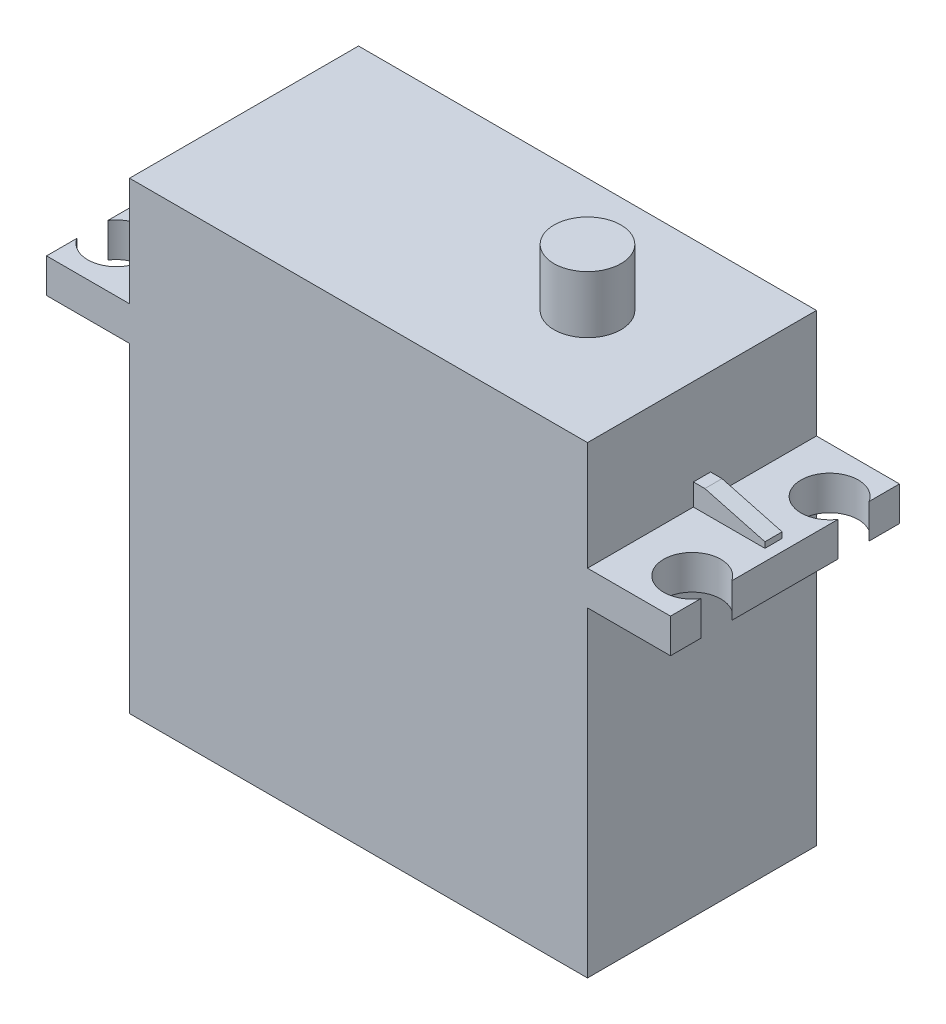
ISO-10303-21;
HEADER;
FILE_DESCRIPTION(('STEP AP214'),'2;1');
FILE_NAME('part.step','',(''),(''),'','','');
FILE_SCHEMA(('AUTOMOTIVE_DESIGN { 1 0 10303 214 1 1 1 1 }'));
ENDSEC;
DATA;
#1=APPLICATION_CONTEXT('core data for automotive mechanical design processes');
#2=APPLICATION_PROTOCOL_DEFINITION('international standard','automotive_design',2000,#1);
#3=PRODUCT_CONTEXT('',#1,'mechanical');
#4=PRODUCT('Part','Part','',(#3));
#5=PRODUCT_RELATED_PRODUCT_CATEGORY('part','',(#4));
#6=PRODUCT_DEFINITION_FORMATION('','',#4);
#7=PRODUCT_DEFINITION_CONTEXT('part definition',#1,'design');
#8=PRODUCT_DEFINITION('design','',#6,#7);
#9=PRODUCT_DEFINITION_SHAPE('','',#8);
#10=(LENGTH_UNIT() NAMED_UNIT(*) SI_UNIT(.MILLI.,.METRE.));
#11=(NAMED_UNIT(*) PLANE_ANGLE_UNIT() SI_UNIT($,.RADIAN.));
#12=(NAMED_UNIT(*) SI_UNIT($,.STERADIAN.) SOLID_ANGLE_UNIT());
#13=UNCERTAINTY_MEASURE_WITH_UNIT(LENGTH_MEASURE(1.E-05),#10,'distance_accuracy_value','');
#14=(GEOMETRIC_REPRESENTATION_CONTEXT(3) GLOBAL_UNCERTAINTY_ASSIGNED_CONTEXT((#13)) GLOBAL_UNIT_ASSIGNED_CONTEXT((#10,
#11,#12)) REPRESENTATION_CONTEXT('',''));
#15=CARTESIAN_POINT('',(0.,0.,0.));
#16=DIRECTION('',(0.,0.,1.));
#17=DIRECTION('',(1.,0.,0.));
#18=AXIS2_PLACEMENT_3D('',#15,#16,#17);
#19=CARTESIAN_POINT('',(0.,3.,0.));
#20=DIRECTION('',(0.,-1.,0.));
#21=DIRECTION('',(0.,0.,-1.));
#22=AXIS2_PLACEMENT_3D('',#19,#20,#21);
#23=PLANE('',#22);
#24=DIRECTION('',(1.,0.,0.));
#25=VECTOR('',#24,1.);
#26=CARTESIAN_POINT('',(-26.25,3.,0.749999999999995));
#27=LINE('',#26,#25);
#28=CARTESIAN_POINT('',(-26.25,3.,0.749999999999995));
#29=VERTEX_POINT('',#28);
#30=CARTESIAN_POINT('',(-20.,3.,0.749999999999995));
#31=VERTEX_POINT('',#30);
#32=EDGE_CURVE('E252',#29,#31,#27,.T.);
#33=ORIENTED_EDGE('',*,*,#32,.F.);
#34=DIRECTION('',(0.,0.,-1.));
#35=VECTOR('',#34,1.);
#36=CARTESIAN_POINT('',(-26.25,3.,0.749999999999995));
#37=LINE('',#36,#35);
#38=CARTESIAN_POINT('',(-26.25,3.,-0.750000000000005));
#39=VERTEX_POINT('',#38);
#40=EDGE_CURVE('E245',#29,#39,#37,.T.);
#41=ORIENTED_EDGE('',*,*,#40,.T.);
#42=DIRECTION('',(1.,0.,0.));
#43=VECTOR('',#42,1.);
#44=CARTESIAN_POINT('',(-26.25,3.,-0.750000000000005));
#45=LINE('',#44,#43);
#46=CARTESIAN_POINT('',(-20.,3.,-0.750000000000005));
#47=VERTEX_POINT('',#46);
#48=EDGE_CURVE('E230',#39,#47,#45,.T.);
#49=ORIENTED_EDGE('',*,*,#48,.T.);
#50=DIRECTION('',(0.,0.,1.));
#51=VECTOR('',#50,1.);
#52=CARTESIAN_POINT('',(-20.,3.,-10.));
#53=LINE('',#52,#51);
#54=CARTESIAN_POINT('',(-20.,3.,-10.));
#55=VERTEX_POINT('',#54);
#56=EDGE_CURVE('E334',#55,#47,#53,.T.);
#57=ORIENTED_EDGE('',*,*,#56,.F.);
#58=DIRECTION('',(-1.,0.,0.));
#59=VECTOR('',#58,1.);
#60=CARTESIAN_POINT('',(27.25,3.,-10.));
#61=LINE('',#60,#59);
#62=CARTESIAN_POINT('',(-27.25,3.,-10.));
#63=VERTEX_POINT('',#62);
#64=EDGE_CURVE('E371',#55,#63,#61,.T.);
#65=ORIENTED_EDGE('',*,*,#64,.T.);
#66=DIRECTION('',(0.,0.,1.));
#67=VECTOR('',#66,1.);
#68=CARTESIAN_POINT('',(-27.25,3.,-10.));
#69=LINE('',#68,#67);
#70=CARTESIAN_POINT('',(-27.25,3.,-7.35646599662505));
#71=VERTEX_POINT('',#70);
#72=EDGE_CURVE('E358',#63,#71,#69,.T.);
#73=ORIENTED_EDGE('',*,*,#72,.T.);
#74=CARTESIAN_POINT('',(-25.15,3.,-6.));
#75=DIRECTION('',(0.,1.,0.));
#76=DIRECTION('',(0.,0.,1.));
#77=AXIS2_PLACEMENT_3D('',#74,#75,#76);
#78=CIRCLE('',#77,2.5);
#79=CARTESIAN_POINT('',(-27.25,3.,-4.64353400337495));
#80=VERTEX_POINT('',#79);
#81=EDGE_CURVE('E291',#80,#71,#78,.T.);
#82=ORIENTED_EDGE('',*,*,#81,.F.);
#83=CARTESIAN_POINT('',(-27.25,3.,4.64353400337495));
#84=VERTEX_POINT('',#83);
#85=EDGE_CURVE('E362',#80,#84,#69,.T.);
#86=ORIENTED_EDGE('',*,*,#85,.T.);
#87=CARTESIAN_POINT('',(-25.15,3.,6.));
#88=DIRECTION('',(0.,1.,0.));
#89=DIRECTION('',(0.,0.,1.));
#90=AXIS2_PLACEMENT_3D('',#87,#88,#89);
#91=CIRCLE('',#90,2.5);
#92=CARTESIAN_POINT('',(-27.25,3.,7.35646599662505));
#93=VERTEX_POINT('',#92);
#94=EDGE_CURVE('E302',#93,#84,#91,.T.);
#95=ORIENTED_EDGE('',*,*,#94,.F.);
#96=CARTESIAN_POINT('',(-27.25,3.,10.));
#97=VERTEX_POINT('',#96);
#98=EDGE_CURVE('E363',#93,#97,#69,.T.);
#99=ORIENTED_EDGE('',*,*,#98,.T.);
#100=DIRECTION('',(1.,0.,0.));
#101=VECTOR('',#100,1.);
#102=CARTESIAN_POINT('',(27.25,3.,10.));
#103=LINE('',#102,#101);
#104=CARTESIAN_POINT('',(-20.,3.,10.));
#105=VERTEX_POINT('',#104);
#106=EDGE_CURVE('E364',#97,#105,#103,.T.);
#107=ORIENTED_EDGE('',*,*,#106,.T.);
#108=EDGE_CURVE('E344',#31,#105,#53,.T.);
#109=ORIENTED_EDGE('',*,*,#108,.F.);
#110=EDGE_LOOP('',(#33,#41,#49,#57,#65,#73,#82,#86,#95,#99,#107,#109));
#111=FACE_BOUND('',#110,.T.);
#112=ADVANCED_FACE('F32',(#111),#23,.F.);
#113=CARTESIAN_POINT('',(-20.,12.5,-10.));
#114=DIRECTION('',(1.,0.,0.));
#115=DIRECTION('',(0.,0.,-1.));
#116=AXIS2_PLACEMENT_3D('',#113,#114,#115);
#117=PLANE('',#116);
#118=DIRECTION('',(0.,1.,0.));
#119=VECTOR('',#118,1.);
#120=CARTESIAN_POINT('',(-20.,3.,0.749999999999995));
#121=LINE('',#120,#119);
#122=CARTESIAN_POINT('',(-20.,4.9,0.749999999999995));
#123=VERTEX_POINT('',#122);
#124=EDGE_CURVE('E253',#31,#123,#121,.T.);
#125=ORIENTED_EDGE('',*,*,#124,.F.);
#126=ORIENTED_EDGE('',*,*,#108,.T.);
#127=DIRECTION('',(0.,-1.,0.));
#128=VECTOR('',#127,1.);
#129=CARTESIAN_POINT('',(-20.,12.5,10.));
#130=LINE('',#129,#128);
#131=CARTESIAN_POINT('',(-20.,12.5,10.));
#132=VERTEX_POINT('',#131);
#133=EDGE_CURVE('E340',#132,#105,#130,.T.);
#134=ORIENTED_EDGE('',*,*,#133,.F.);
#135=DIRECTION('',(0.,0.,1.));
#136=VECTOR('',#135,1.);
#137=CARTESIAN_POINT('',(-20.,12.5,-10.));
#138=LINE('',#137,#136);
#139=CARTESIAN_POINT('',(-20.,12.5,-10.));
#140=VERTEX_POINT('',#139);
#141=EDGE_CURVE('E338',#140,#132,#138,.T.);
#142=ORIENTED_EDGE('',*,*,#141,.F.);
#143=DIRECTION('',(0.,-1.,0.));
#144=VECTOR('',#143,1.);
#145=CARTESIAN_POINT('',(-20.,12.5,-10.));
#146=LINE('',#145,#144);
#147=EDGE_CURVE('E348',#140,#55,#146,.T.);
#148=ORIENTED_EDGE('',*,*,#147,.T.);
#149=ORIENTED_EDGE('',*,*,#56,.T.);
#150=DIRECTION('',(0.,1.,0.));
#151=VECTOR('',#150,1.);
#152=CARTESIAN_POINT('',(-20.,3.,-0.750000000000005));
#153=LINE('',#152,#151);
#154=CARTESIAN_POINT('',(-20.,4.9,-0.750000000000006));
#155=VERTEX_POINT('',#154);
#156=EDGE_CURVE('E236',#47,#155,#153,.T.);
#157=ORIENTED_EDGE('',*,*,#156,.T.);
#158=DIRECTION('',(0.,0.,-1.));
#159=VECTOR('',#158,1.);
#160=CARTESIAN_POINT('',(-20.,4.9,0.749999999999995));
#161=LINE('',#160,#159);
#162=EDGE_CURVE('E263',#123,#155,#161,.T.);
#163=ORIENTED_EDGE('',*,*,#162,.F.);
#164=EDGE_LOOP('',(#125,#126,#134,#142,#148,#149,#157,#163));
#165=FACE_BOUND('',#164,.T.);
#166=ADVANCED_FACE('F493',(#165),#117,.F.);
#167=DIRECTION('',(-1.,0.,0.));
#168=VECTOR('',#167,1.);
#169=CARTESIAN_POINT('',(26.25,3.,0.749999999999995));
#170=LINE('',#169,#168);
#171=CARTESIAN_POINT('',(26.25,3.,0.749999999999995));
#172=VERTEX_POINT('',#171);
#173=CARTESIAN_POINT('',(20.,3.,0.749999999999995));
#174=VERTEX_POINT('',#173);
#175=EDGE_CURVE('E273',#172,#174,#170,.T.);
#176=ORIENTED_EDGE('',*,*,#175,.T.);
#177=DIRECTION('',(0.,0.,-1.));
#178=VECTOR('',#177,1.);
#179=CARTESIAN_POINT('',(20.,3.,9.99999999999999));
#180=LINE('',#179,#178);
#181=CARTESIAN_POINT('',(20.,3.,10.));
#182=VERTEX_POINT('',#181);
#183=EDGE_CURVE('E341',#182,#174,#180,.T.);
#184=ORIENTED_EDGE('',*,*,#183,.F.);
#185=CARTESIAN_POINT('',(27.25,3.,10.));
#186=VERTEX_POINT('',#185);
#187=EDGE_CURVE('E361',#182,#186,#103,.T.);
#188=ORIENTED_EDGE('',*,*,#187,.T.);
#189=DIRECTION('',(0.,0.,-1.));
#190=VECTOR('',#189,1.);
#191=CARTESIAN_POINT('',(27.25,3.,-10.));
#192=LINE('',#191,#190);
#193=CARTESIAN_POINT('',(27.25,3.,7.35646599662505));
#194=VERTEX_POINT('',#193);
#195=EDGE_CURVE('E368',#186,#194,#192,.T.);
#196=ORIENTED_EDGE('',*,*,#195,.T.);
#197=CARTESIAN_POINT('',(25.15,3.,6.));
#198=DIRECTION('',(0.,1.,0.));
#199=DIRECTION('',(0.,0.,1.));
#200=AXIS2_PLACEMENT_3D('',#197,#198,#199);
#201=CIRCLE('',#200,2.5);
#202=CARTESIAN_POINT('',(27.25,3.,4.64353400337495));
#203=VERTEX_POINT('',#202);
#204=EDGE_CURVE('E305',#203,#194,#201,.T.);
#205=ORIENTED_EDGE('',*,*,#204,.F.);
#206=CARTESIAN_POINT('',(27.25,3.,-4.64353400337495));
#207=VERTEX_POINT('',#206);
#208=EDGE_CURVE('E372',#203,#207,#192,.T.);
#209=ORIENTED_EDGE('',*,*,#208,.T.);
#210=CARTESIAN_POINT('',(25.15,3.,-6.));
#211=DIRECTION('',(0.,1.,0.));
#212=DIRECTION('',(0.,0.,1.));
#213=AXIS2_PLACEMENT_3D('',#210,#211,#212);
#214=CIRCLE('',#213,2.5);
#215=CARTESIAN_POINT('',(27.25,3.,-7.35646599662505));
#216=VERTEX_POINT('',#215);
#217=EDGE_CURVE('E303',#216,#207,#214,.T.);
#218=ORIENTED_EDGE('',*,*,#217,.F.);
#219=CARTESIAN_POINT('',(27.25,3.,-10.));
#220=VERTEX_POINT('',#219);
#221=EDGE_CURVE('E367',#216,#220,#192,.T.);
#222=ORIENTED_EDGE('',*,*,#221,.T.);
#223=CARTESIAN_POINT('',(20.,3.,-10.));
#224=VERTEX_POINT('',#223);
#225=EDGE_CURVE('E373',#220,#224,#61,.T.);
#226=ORIENTED_EDGE('',*,*,#225,.T.);
#227=CARTESIAN_POINT('',(20.,3.,-0.750000000000006));
#228=VERTEX_POINT('',#227);
#229=EDGE_CURVE('E327',#228,#224,#180,.T.);
#230=ORIENTED_EDGE('',*,*,#229,.F.);
#231=DIRECTION('',(-1.,0.,0.));
#232=VECTOR('',#231,1.);
#233=CARTESIAN_POINT('',(26.25,3.,-0.750000000000005));
#234=LINE('',#233,#232);
#235=CARTESIAN_POINT('',(26.25,3.,-0.750000000000005));
#236=VERTEX_POINT('',#235);
#237=EDGE_CURVE('E55',#236,#228,#234,.T.);
#238=ORIENTED_EDGE('',*,*,#237,.F.);
#239=DIRECTION('',(0.,0.,-1.));
#240=VECTOR('',#239,1.);
#241=CARTESIAN_POINT('',(26.25,3.,0.749999999999995));
#242=LINE('',#241,#240);
#243=EDGE_CURVE('E289',#172,#236,#242,.T.);
#244=ORIENTED_EDGE('',*,*,#243,.F.);
#245=EDGE_LOOP('',(#176,#184,#188,#196,#205,#209,#218,#222,#226,#230,#238,#244));
#246=FACE_BOUND('',#245,.T.);
#247=ADVANCED_FACE('F495',(#246),#23,.F.);
#248=CARTESIAN_POINT('',(20.,12.5,9.99999999999999));
#249=DIRECTION('',(-1.,0.,0.));
#250=DIRECTION('',(0.,0.,1.));
#251=AXIS2_PLACEMENT_3D('',#248,#249,#250);
#252=PLANE('',#251);
#253=DIRECTION('',(0.,1.,0.));
#254=VECTOR('',#253,1.);
#255=CARTESIAN_POINT('',(20.,3.,0.749999999999995));
#256=LINE('',#255,#254);
#257=CARTESIAN_POINT('',(20.,4.9,0.749999999999995));
#258=VERTEX_POINT('',#257);
#259=EDGE_CURVE('E276',#174,#258,#256,.T.);
#260=ORIENTED_EDGE('',*,*,#259,.T.);
#261=DIRECTION('',(0.,0.,-1.));
#262=VECTOR('',#261,1.);
#263=CARTESIAN_POINT('',(20.,4.9,0.749999999999995));
#264=LINE('',#263,#262);
#265=CARTESIAN_POINT('',(20.,4.9,-0.750000000000005));
#266=VERTEX_POINT('',#265);
#267=EDGE_CURVE('E288',#258,#266,#264,.T.);
#268=ORIENTED_EDGE('',*,*,#267,.T.);
#269=DIRECTION('',(0.,1.,0.));
#270=VECTOR('',#269,1.);
#271=CARTESIAN_POINT('',(20.,3.,-0.750000000000005));
#272=LINE('',#271,#270);
#273=EDGE_CURVE('E262',#228,#266,#272,.T.);
#274=ORIENTED_EDGE('',*,*,#273,.F.);
#275=ORIENTED_EDGE('',*,*,#229,.T.);
#276=DIRECTION('',(0.,-1.,0.));
#277=VECTOR('',#276,1.);
#278=CARTESIAN_POINT('',(20.,12.5,-10.));
#279=LINE('',#278,#277);
#280=CARTESIAN_POINT('',(20.,12.5,-10.));
#281=VERTEX_POINT('',#280);
#282=EDGE_CURVE('E351',#281,#224,#279,.T.);
#283=ORIENTED_EDGE('',*,*,#282,.F.);
#284=DIRECTION('',(0.,0.,-1.));
#285=VECTOR('',#284,1.);
#286=CARTESIAN_POINT('',(20.,12.5,9.99999999999999));
#287=LINE('',#286,#285);
#288=CARTESIAN_POINT('',(20.,12.5,9.99999999999999));
#289=VERTEX_POINT('',#288);
#290=EDGE_CURVE('E333',#289,#281,#287,.T.);
#291=ORIENTED_EDGE('',*,*,#290,.F.);
#292=DIRECTION('',(0.,-1.,0.));
#293=VECTOR('',#292,1.);
#294=CARTESIAN_POINT('',(20.,12.5,9.99999999999999));
#295=LINE('',#294,#293);
#296=EDGE_CURVE('E354',#289,#182,#295,.T.);
#297=ORIENTED_EDGE('',*,*,#296,.T.);
#298=ORIENTED_EDGE('',*,*,#183,.T.);
#299=EDGE_LOOP('',(#260,#268,#274,#275,#283,#291,#297,#298));
#300=FACE_BOUND('',#299,.T.);
#301=ADVANCED_FACE('F504',(#300),#252,.F.);
#302=CARTESIAN_POINT('',(-27.25,3.,-10.));
#303=DIRECTION('',(1.,0.,0.));
#304=DIRECTION('',(0.,0.,-1.));
#305=AXIS2_PLACEMENT_3D('',#302,#303,#304);
#306=PLANE('',#305);
#307=DIRECTION('',(0.,0.,1.));
#308=VECTOR('',#307,1.);
#309=CARTESIAN_POINT('',(-27.25,0.,-10.));
#310=LINE('',#309,#308);
#311=CARTESIAN_POINT('',(-27.25,0.,-4.64353400337495));
#312=VERTEX_POINT('',#311);
#313=CARTESIAN_POINT('',(-27.25,0.,4.64353400337495));
#314=VERTEX_POINT('',#313);
#315=EDGE_CURVE('E381',#312,#314,#310,.T.);
#316=ORIENTED_EDGE('',*,*,#315,.T.);
#317=DIRECTION('',(0.,1.,0.));
#318=VECTOR('',#317,1.);
#319=CARTESIAN_POINT('',(-27.25,-7.07106781186547,4.64353400337495));
#320=LINE('',#319,#318);
#321=EDGE_CURVE('E11',#314,#84,#320,.T.);
#322=ORIENTED_EDGE('',*,*,#321,.T.);
#323=ORIENTED_EDGE('',*,*,#85,.F.);
#324=DIRECTION('',(0.,1.,0.));
#325=VECTOR('',#324,1.);
#326=CARTESIAN_POINT('',(-27.25,-7.07106781186547,-4.64353400337495));
#327=LINE('',#326,#325);
#328=EDGE_CURVE('E435',#80,#312,#327,.F.);
#329=ORIENTED_EDGE('',*,*,#328,.T.);
#330=EDGE_LOOP('',(#316,#322,#323,#329));
#331=FACE_BOUND('',#330,.T.);
#332=ADVANCED_FACE('F454',(#331),#306,.F.);
#333=CARTESIAN_POINT('',(-27.25,0.,-10.));
#334=VERTEX_POINT('',#333);
#335=CARTESIAN_POINT('',(-27.25,0.,-7.35646599662505));
#336=VERTEX_POINT('',#335);
#337=EDGE_CURVE('E377',#334,#336,#310,.T.);
#338=ORIENTED_EDGE('',*,*,#337,.T.);
#339=DIRECTION('',(0.,1.,0.));
#340=VECTOR('',#339,1.);
#341=CARTESIAN_POINT('',(-27.25,-7.07106781186547,-7.35646599662505));
#342=LINE('',#341,#340);
#343=EDGE_CURVE('E438',#336,#71,#342,.T.);
#344=ORIENTED_EDGE('',*,*,#343,.T.);
#345=ORIENTED_EDGE('',*,*,#72,.F.);
#346=DIRECTION('',(0.,-1.,0.));
#347=VECTOR('',#346,1.);
#348=CARTESIAN_POINT('',(-27.25,3.,-10.));
#349=LINE('',#348,#347);
#350=EDGE_CURVE('E376',#63,#334,#349,.T.);
#351=ORIENTED_EDGE('',*,*,#350,.T.);
#352=EDGE_LOOP('',(#338,#344,#345,#351));
#353=FACE_BOUND('',#352,.T.);
#354=ADVANCED_FACE('F461',(#353),#306,.F.);
#355=CARTESIAN_POINT('',(27.25,3.,-10.));
#356=DIRECTION('',(-1.,0.,0.));
#357=DIRECTION('',(0.,0.,1.));
#358=AXIS2_PLACEMENT_3D('',#355,#356,#357);
#359=PLANE('',#358);
#360=DIRECTION('',(0.,0.,-1.));
#361=VECTOR('',#360,1.);
#362=CARTESIAN_POINT('',(27.25,0.,-10.));
#363=LINE('',#362,#361);
#364=CARTESIAN_POINT('',(27.25,0.,4.64353400337495));
#365=VERTEX_POINT('',#364);
#366=CARTESIAN_POINT('',(27.25,0.,-4.64353400337495));
#367=VERTEX_POINT('',#366);
#368=EDGE_CURVE('E390',#365,#367,#363,.T.);
#369=ORIENTED_EDGE('',*,*,#368,.T.);
#370=DIRECTION('',(0.,1.,0.));
#371=VECTOR('',#370,1.);
#372=CARTESIAN_POINT('',(27.25,-7.07106781186547,-4.64353400337495));
#373=LINE('',#372,#371);
#374=EDGE_CURVE('E320',#367,#207,#373,.T.);
#375=ORIENTED_EDGE('',*,*,#374,.T.);
#376=ORIENTED_EDGE('',*,*,#208,.F.);
#377=DIRECTION('',(0.,1.,0.));
#378=VECTOR('',#377,1.);
#379=CARTESIAN_POINT('',(27.25,-7.07106781186547,4.64353400337495));
#380=LINE('',#379,#378);
#381=EDGE_CURVE('E311',#203,#365,#380,.F.);
#382=ORIENTED_EDGE('',*,*,#381,.T.);
#383=EDGE_LOOP('',(#369,#375,#376,#382));
#384=FACE_BOUND('',#383,.T.);
#385=ADVANCED_FACE('F554',(#384),#359,.F.);
#386=CARTESIAN_POINT('',(27.25,0.,10.));
#387=VERTEX_POINT('',#386);
#388=CARTESIAN_POINT('',(27.25,0.,7.35646599662505));
#389=VERTEX_POINT('',#388);
#390=EDGE_CURVE('E386',#387,#389,#363,.T.);
#391=ORIENTED_EDGE('',*,*,#390,.T.);
#392=DIRECTION('',(0.,1.,0.));
#393=VECTOR('',#392,1.);
#394=CARTESIAN_POINT('',(27.25,-7.07106781186547,7.35646599662505));
#395=LINE('',#394,#393);
#396=EDGE_CURVE('E314',#389,#194,#395,.T.);
#397=ORIENTED_EDGE('',*,*,#396,.T.);
#398=ORIENTED_EDGE('',*,*,#195,.F.);
#399=DIRECTION('',(0.,-1.,0.));
#400=VECTOR('',#399,1.);
#401=CARTESIAN_POINT('',(27.25,3.,10.));
#402=LINE('',#401,#400);
#403=EDGE_CURVE('E399',#186,#387,#402,.T.);
#404=ORIENTED_EDGE('',*,*,#403,.T.);
#405=EDGE_LOOP('',(#391,#397,#398,#404));
#406=FACE_BOUND('',#405,.T.);
#407=ADVANCED_FACE('F522',(#406),#359,.F.);
#408=CARTESIAN_POINT('',(-20.,-28.,-10.));
#409=DIRECTION('',(-1.,0.,0.));
#410=DIRECTION('',(0.,0.,1.));
#411=AXIS2_PLACEMENT_3D('',#408,#409,#410);
#412=PLANE('',#411);
#413=DIRECTION('',(0.,0.,1.));
#414=VECTOR('',#413,1.);
#415=CARTESIAN_POINT('',(-20.,0.,-10.));
#416=LINE('',#415,#414);
#417=CARTESIAN_POINT('',(-20.,0.,-10.));
#418=VERTEX_POINT('',#417);
#419=CARTESIAN_POINT('',(-20.,0.,10.));
#420=VERTEX_POINT('',#419);
#421=EDGE_CURVE('E405',#418,#420,#416,.T.);
#422=ORIENTED_EDGE('',*,*,#421,.F.);
#423=DIRECTION('',(0.,1.,0.));
#424=VECTOR('',#423,1.);
#425=CARTESIAN_POINT('',(-20.,-28.,-10.));
#426=LINE('',#425,#424);
#427=CARTESIAN_POINT('',(-20.,-28.,-10.));
#428=VERTEX_POINT('',#427);
#429=EDGE_CURVE('E424',#428,#418,#426,.T.);
#430=ORIENTED_EDGE('',*,*,#429,.F.);
#431=DIRECTION('',(0.,0.,1.));
#432=VECTOR('',#431,1.);
#433=CARTESIAN_POINT('',(-20.,-28.,-10.));
#434=LINE('',#433,#432);
#435=CARTESIAN_POINT('',(-20.,-28.,10.));
#436=VERTEX_POINT('',#435);
#437=EDGE_CURVE('E406',#428,#436,#434,.T.);
#438=ORIENTED_EDGE('',*,*,#437,.T.);
#439=DIRECTION('',(0.,1.,0.));
#440=VECTOR('',#439,1.);
#441=CARTESIAN_POINT('',(-20.,-28.,10.));
#442=LINE('',#441,#440);
#443=EDGE_CURVE('E419',#436,#420,#442,.T.);
#444=ORIENTED_EDGE('',*,*,#443,.T.);
#445=EDGE_LOOP('',(#422,#430,#438,#444));
#446=FACE_BOUND('',#445,.T.);
#447=ADVANCED_FACE('F34',(#446),#412,.T.);
#448=CARTESIAN_POINT('',(20.,-28.,-10.));
#449=DIRECTION('',(0.,0.,-1.));
#450=DIRECTION('',(-1.,0.,0.));
#451=AXIS2_PLACEMENT_3D('',#448,#449,#450);
#452=PLANE('',#451);
#453=ORIENTED_EDGE('',*,*,#429,.T.);
#454=DIRECTION('',(-1.,0.,0.));
#455=VECTOR('',#454,1.);
#456=CARTESIAN_POINT('',(27.25,0.,-10.));
#457=LINE('',#456,#455);
#458=EDGE_CURVE('E389',#418,#334,#457,.T.);
#459=ORIENTED_EDGE('',*,*,#458,.T.);
#460=ORIENTED_EDGE('',*,*,#350,.F.);
#461=ORIENTED_EDGE('',*,*,#64,.F.);
#462=ORIENTED_EDGE('',*,*,#147,.F.);
#463=DIRECTION('',(-1.,0.,0.));
#464=VECTOR('',#463,1.);
#465=CARTESIAN_POINT('',(20.,12.5,-10.));
#466=LINE('',#465,#464);
#467=EDGE_CURVE('E336',#281,#140,#466,.T.);
#468=ORIENTED_EDGE('',*,*,#467,.F.);
#469=ORIENTED_EDGE('',*,*,#282,.T.);
#470=ORIENTED_EDGE('',*,*,#225,.F.);
#471=DIRECTION('',(0.,-1.,0.));
#472=VECTOR('',#471,1.);
#473=CARTESIAN_POINT('',(27.25,3.,-10.));
#474=LINE('',#473,#472);
#475=CARTESIAN_POINT('',(27.25,0.,-10.));
#476=VERTEX_POINT('',#475);
#477=EDGE_CURVE('E396',#220,#476,#474,.T.);
#478=ORIENTED_EDGE('',*,*,#477,.T.);
#479=CARTESIAN_POINT('',(20.,0.,-10.));
#480=VERTEX_POINT('',#479);
#481=EDGE_CURVE('E391',#476,#480,#457,.T.);
#482=ORIENTED_EDGE('',*,*,#481,.T.);
#483=DIRECTION('',(0.,1.,0.));
#484=VECTOR('',#483,1.);
#485=CARTESIAN_POINT('',(20.,-28.,-10.));
#486=LINE('',#485,#484);
#487=CARTESIAN_POINT('',(20.,-28.,-10.));
#488=VERTEX_POINT('',#487);
#489=EDGE_CURVE('E427',#488,#480,#486,.T.);
#490=ORIENTED_EDGE('',*,*,#489,.F.);
#491=DIRECTION('',(-1.,0.,0.));
#492=VECTOR('',#491,1.);
#493=CARTESIAN_POINT('',(20.,-28.,-10.));
#494=LINE('',#493,#492);
#495=EDGE_CURVE('E416',#488,#428,#494,.T.);
#496=ORIENTED_EDGE('',*,*,#495,.T.);
#497=EDGE_LOOP('',(#453,#459,#460,#461,#462,#468,#469,#470,#478,#482,#490,#496));
#498=FACE_BOUND('',#497,.T.);
#499=ADVANCED_FACE('F466',(#498),#452,.T.);
#500=CARTESIAN_POINT('',(20.,-28.,-10.));
#501=DIRECTION('',(1.,0.,0.));
#502=DIRECTION('',(0.,0.,-1.));
#503=AXIS2_PLACEMENT_3D('',#500,#501,#502);
#504=PLANE('',#503);
#505=DIRECTION('',(0.,0.,-1.));
#506=VECTOR('',#505,1.);
#507=CARTESIAN_POINT('',(20.,0.,-10.));
#508=LINE('',#507,#506);
#509=CARTESIAN_POINT('',(20.,0.,9.99999999999999));
#510=VERTEX_POINT('',#509);
#511=EDGE_CURVE('E410',#510,#480,#508,.T.);
#512=ORIENTED_EDGE('',*,*,#511,.F.);
#513=DIRECTION('',(0.,1.,0.));
#514=VECTOR('',#513,1.);
#515=CARTESIAN_POINT('',(20.,-28.,9.99999999999999));
#516=LINE('',#515,#514);
#517=CARTESIAN_POINT('',(20.,-28.,9.99999999999999));
#518=VERTEX_POINT('',#517);
#519=EDGE_CURVE('E429',#518,#510,#516,.T.);
#520=ORIENTED_EDGE('',*,*,#519,.F.);
#521=DIRECTION('',(0.,0.,-1.));
#522=VECTOR('',#521,1.);
#523=CARTESIAN_POINT('',(20.,-28.,-10.));
#524=LINE('',#523,#522);
#525=EDGE_CURVE('E413',#518,#488,#524,.T.);
#526=ORIENTED_EDGE('',*,*,#525,.T.);
#527=ORIENTED_EDGE('',*,*,#489,.T.);
#528=EDGE_LOOP('',(#512,#520,#526,#527));
#529=FACE_BOUND('',#528,.T.);
#530=ADVANCED_FACE('F542',(#529),#504,.T.);
#531=CARTESIAN_POINT('',(20.,-28.,9.99999999999999));
#532=DIRECTION('',(0.,0.,1.));
#533=DIRECTION('',(1.,0.,0.));
#534=AXIS2_PLACEMENT_3D('',#531,#532,#533);
#535=PLANE('',#534);
#536=ORIENTED_EDGE('',*,*,#519,.T.);
#537=DIRECTION('',(1.,0.,0.));
#538=VECTOR('',#537,1.);
#539=CARTESIAN_POINT('',(27.25,0.,10.));
#540=LINE('',#539,#538);
#541=EDGE_CURVE('E380',#510,#387,#540,.T.);
#542=ORIENTED_EDGE('',*,*,#541,.T.);
#543=ORIENTED_EDGE('',*,*,#403,.F.);
#544=ORIENTED_EDGE('',*,*,#187,.F.);
#545=ORIENTED_EDGE('',*,*,#296,.F.);
#546=DIRECTION('',(1.,0.,0.));
#547=VECTOR('',#546,1.);
#548=CARTESIAN_POINT('',(-20.,12.5,10.));
#549=LINE('',#548,#547);
#550=EDGE_CURVE('E330',#132,#289,#549,.T.);
#551=ORIENTED_EDGE('',*,*,#550,.F.);
#552=ORIENTED_EDGE('',*,*,#133,.T.);
#553=ORIENTED_EDGE('',*,*,#106,.F.);
#554=DIRECTION('',(0.,-1.,0.));
#555=VECTOR('',#554,1.);
#556=CARTESIAN_POINT('',(-27.25,3.,10.));
#557=LINE('',#556,#555);
#558=CARTESIAN_POINT('',(-27.25,0.,10.));
#559=VERTEX_POINT('',#558);
#560=EDGE_CURVE('E402',#97,#559,#557,.T.);
#561=ORIENTED_EDGE('',*,*,#560,.T.);
#562=EDGE_CURVE('E382',#559,#420,#540,.T.);
#563=ORIENTED_EDGE('',*,*,#562,.T.);
#564=ORIENTED_EDGE('',*,*,#443,.F.);
#565=DIRECTION('',(1.,0.,0.));
#566=VECTOR('',#565,1.);
#567=CARTESIAN_POINT('',(20.,-28.,9.99999999999999));
#568=LINE('',#567,#566);
#569=EDGE_CURVE('E409',#436,#518,#568,.T.);
#570=ORIENTED_EDGE('',*,*,#569,.T.);
#571=EDGE_LOOP('',(#536,#542,#543,#544,#545,#551,#552,#553,#561,#563,#564,#570));
#572=FACE_BOUND('',#571,.T.);
#573=ADVANCED_FACE('F471',(#572),#535,.T.);
#574=CARTESIAN_POINT('',(0.,-28.,0.));
#575=DIRECTION('',(0.,-1.,0.));
#576=DIRECTION('',(0.,0.,-1.));
#577=AXIS2_PLACEMENT_3D('',#574,#575,#576);
#578=PLANE('',#577);
#579=ORIENTED_EDGE('',*,*,#437,.F.);
#580=ORIENTED_EDGE('',*,*,#495,.F.);
#581=ORIENTED_EDGE('',*,*,#525,.F.);
#582=ORIENTED_EDGE('',*,*,#569,.F.);
#583=EDGE_LOOP('',(#579,#580,#581,#582));
#584=FACE_BOUND('',#583,.T.);
#585=ADVANCED_FACE('F547',(#584),#578,.T.);
#586=CARTESIAN_POINT('',(0.,0.,0.));
#587=DIRECTION('',(0.,-1.,0.));
#588=DIRECTION('',(0.,0.,-1.));
#589=AXIS2_PLACEMENT_3D('',#586,#587,#588);
#590=PLANE('',#589);
#591=CARTESIAN_POINT('',(-25.15,0.,6.));
#592=DIRECTION('',(0.,-1.,0.));
#593=DIRECTION('',(0.,0.,-1.));
#594=AXIS2_PLACEMENT_3D('',#591,#592,#593);
#595=CIRCLE('',#594,2.5);
#596=CARTESIAN_POINT('',(-27.25,0.,7.35646599662505));
#597=VERTEX_POINT('',#596);
#598=EDGE_CURVE('E306',#597,#314,#595,.F.);
#599=ORIENTED_EDGE('',*,*,#598,.T.);
#600=ORIENTED_EDGE('',*,*,#315,.F.);
#601=CARTESIAN_POINT('',(-25.15,0.,-6.));
#602=DIRECTION('',(0.,-1.,0.));
#603=DIRECTION('',(0.,0.,-1.));
#604=AXIS2_PLACEMENT_3D('',#601,#602,#603);
#605=CIRCLE('',#604,2.5);
#606=EDGE_CURVE('E299',#312,#336,#605,.F.);
#607=ORIENTED_EDGE('',*,*,#606,.T.);
#608=ORIENTED_EDGE('',*,*,#337,.F.);
#609=ORIENTED_EDGE('',*,*,#458,.F.);
#610=ORIENTED_EDGE('',*,*,#421,.T.);
#611=ORIENTED_EDGE('',*,*,#562,.F.);
#612=EDGE_CURVE('E357',#597,#559,#310,.T.);
#613=ORIENTED_EDGE('',*,*,#612,.F.);
#614=EDGE_LOOP('',(#599,#600,#607,#608,#609,#610,#611,#613));
#615=FACE_BOUND('',#614,.T.);
#616=ADVANCED_FACE('F450',(#615),#590,.T.);
#617=ORIENTED_EDGE('',*,*,#98,.F.);
#618=DIRECTION('',(0.,1.,0.));
#619=VECTOR('',#618,1.);
#620=CARTESIAN_POINT('',(-27.25,-7.07106781186547,7.35646599662505));
#621=LINE('',#620,#619);
#622=EDGE_CURVE('E40',#93,#597,#621,.F.);
#623=ORIENTED_EDGE('',*,*,#622,.T.);
#624=ORIENTED_EDGE('',*,*,#612,.T.);
#625=ORIENTED_EDGE('',*,*,#560,.F.);
#626=EDGE_LOOP('',(#617,#623,#624,#625));
#627=FACE_BOUND('',#626,.T.);
#628=ADVANCED_FACE('F444',(#627),#306,.F.);
#629=ORIENTED_EDGE('',*,*,#221,.F.);
#630=DIRECTION('',(0.,1.,0.));
#631=VECTOR('',#630,1.);
#632=CARTESIAN_POINT('',(27.25,-7.07106781186547,-7.35646599662505));
#633=LINE('',#632,#631);
#634=CARTESIAN_POINT('',(27.25,0.,-7.35646599662505));
#635=VERTEX_POINT('',#634);
#636=EDGE_CURVE('E317',#216,#635,#633,.F.);
#637=ORIENTED_EDGE('',*,*,#636,.T.);
#638=EDGE_CURVE('E385',#635,#476,#363,.T.);
#639=ORIENTED_EDGE('',*,*,#638,.T.);
#640=ORIENTED_EDGE('',*,*,#477,.F.);
#641=EDGE_LOOP('',(#629,#637,#639,#640));
#642=FACE_BOUND('',#641,.T.);
#643=ADVANCED_FACE('F537',(#642),#359,.F.);
#644=CARTESIAN_POINT('',(25.15,0.,-6.));
#645=DIRECTION('',(0.,-1.,0.));
#646=DIRECTION('',(0.,0.,-1.));
#647=AXIS2_PLACEMENT_3D('',#644,#645,#646);
#648=CIRCLE('',#647,2.5);
#649=EDGE_CURVE('E433',#367,#635,#648,.T.);
#650=ORIENTED_EDGE('',*,*,#649,.F.);
#651=ORIENTED_EDGE('',*,*,#368,.F.);
#652=CARTESIAN_POINT('',(25.15,0.,6.));
#653=DIRECTION('',(0.,-1.,0.));
#654=DIRECTION('',(0.,0.,-1.));
#655=AXIS2_PLACEMENT_3D('',#652,#653,#654);
#656=CIRCLE('',#655,2.5);
#657=EDGE_CURVE('E426',#389,#365,#656,.T.);
#658=ORIENTED_EDGE('',*,*,#657,.F.);
#659=ORIENTED_EDGE('',*,*,#390,.F.);
#660=ORIENTED_EDGE('',*,*,#541,.F.);
#661=ORIENTED_EDGE('',*,*,#511,.T.);
#662=ORIENTED_EDGE('',*,*,#481,.F.);
#663=ORIENTED_EDGE('',*,*,#638,.F.);
#664=EDGE_LOOP('',(#650,#651,#658,#659,#660,#661,#662,#663));
#665=FACE_BOUND('',#664,.T.);
#666=ADVANCED_FACE('F529',(#665),#590,.T.);
#667=CARTESIAN_POINT('',(0.,12.5,0.));
#668=DIRECTION('',(0.,1.,0.));
#669=DIRECTION('',(0.,0.,1.));
#670=AXIS2_PLACEMENT_3D('',#667,#668,#669);
#671=PLANE('',#670);
#672=CARTESIAN_POINT('',(10.,12.5,0.));
#673=DIRECTION('',(0.,1.,0.));
#674=DIRECTION('',(0.,0.,1.));
#675=AXIS2_PLACEMENT_3D('',#672,#673,#674);
#676=CIRCLE('',#675,2.925);
#677=CARTESIAN_POINT('',(10.,12.5,2.925));
#678=VERTEX_POINT('',#677);
#679=EDGE_CURVE('E323',#678,#678,#676,.T.);
#680=ORIENTED_EDGE('',*,*,#679,.F.);
#681=EDGE_LOOP('',(#680));
#682=FACE_BOUND('',#681,.T.);
#683=ORIENTED_EDGE('',*,*,#550,.T.);
#684=ORIENTED_EDGE('',*,*,#290,.T.);
#685=ORIENTED_EDGE('',*,*,#467,.T.);
#686=ORIENTED_EDGE('',*,*,#141,.T.);
#687=EDGE_LOOP('',(#683,#684,#685,#686));
#688=FACE_BOUND('',#687,.T.);
#689=ADVANCED_FACE('F565',(#682,#688),#671,.T.);
#690=CARTESIAN_POINT('',(10.,17.5,0.));
#691=DIRECTION('',(0.,-1.,0.));
#692=DIRECTION('',(0.,0.,-1.));
#693=AXIS2_PLACEMENT_3D('',#690,#691,#692);
#694=CYLINDRICAL_SURFACE('',#693,2.925);
#695=CARTESIAN_POINT('',(10.,17.5,0.));
#696=DIRECTION('',(0.,1.,0.));
#697=DIRECTION('',(0.,0.,1.));
#698=AXIS2_PLACEMENT_3D('',#695,#696,#697);
#699=CIRCLE('',#698,2.925);
#700=CARTESIAN_POINT('',(10.,17.5,2.925));
#701=VERTEX_POINT('',#700);
#702=EDGE_CURVE('E324',#701,#701,#699,.T.);
#703=ORIENTED_EDGE('',*,*,#702,.F.);
#704=EDGE_LOOP('',(#703));
#705=FACE_BOUND('',#704,.T.);
#706=ORIENTED_EDGE('',*,*,#679,.T.);
#707=EDGE_LOOP('',(#706));
#708=FACE_BOUND('',#707,.T.);
#709=ADVANCED_FACE('F777',(#705,#708),#694,.T.);
#710=CARTESIAN_POINT('',(10.,17.5,0.));
#711=DIRECTION('',(0.,1.,0.));
#712=DIRECTION('',(0.,0.,1.));
#713=AXIS2_PLACEMENT_3D('',#710,#711,#712);
#714=PLANE('',#713);
#715=ORIENTED_EDGE('',*,*,#702,.T.);
#716=EDGE_LOOP('',(#715));
#717=FACE_BOUND('',#716,.T.);
#718=ADVANCED_FACE('F618',(#717),#714,.T.);
#719=CARTESIAN_POINT('',(25.15,-7.07106781186547,6.));
#720=DIRECTION('',(0.,1.,0.));
#721=DIRECTION('',(0.,0.,1.));
#722=AXIS2_PLACEMENT_3D('',#719,#720,#721);
#723=CYLINDRICAL_SURFACE('',#722,2.5);
#724=ORIENTED_EDGE('',*,*,#657,.T.);
#725=ORIENTED_EDGE('',*,*,#381,.F.);
#726=ORIENTED_EDGE('',*,*,#204,.T.);
#727=ORIENTED_EDGE('',*,*,#396,.F.);
#728=EDGE_LOOP('',(#724,#725,#726,#727));
#729=FACE_BOUND('',#728,.T.);
#730=ADVANCED_FACE('F488',(#729),#723,.F.);
#731=CARTESIAN_POINT('',(25.15,-7.07106781186547,-6.));
#732=DIRECTION('',(0.,1.,0.));
#733=DIRECTION('',(0.,0.,1.));
#734=AXIS2_PLACEMENT_3D('',#731,#732,#733);
#735=CYLINDRICAL_SURFACE('',#734,2.5);
#736=ORIENTED_EDGE('',*,*,#649,.T.);
#737=ORIENTED_EDGE('',*,*,#636,.F.);
#738=ORIENTED_EDGE('',*,*,#217,.T.);
#739=ORIENTED_EDGE('',*,*,#374,.F.);
#740=EDGE_LOOP('',(#736,#737,#738,#739));
#741=FACE_BOUND('',#740,.T.);
#742=ADVANCED_FACE('F480',(#741),#735,.F.);
#743=CARTESIAN_POINT('',(-25.15,-7.07106781186547,-6.));
#744=DIRECTION('',(0.,1.,0.));
#745=DIRECTION('',(0.,0.,1.));
#746=AXIS2_PLACEMENT_3D('',#743,#744,#745);
#747=CYLINDRICAL_SURFACE('',#746,2.5);
#748=ORIENTED_EDGE('',*,*,#606,.F.);
#749=ORIENTED_EDGE('',*,*,#328,.F.);
#750=ORIENTED_EDGE('',*,*,#81,.T.);
#751=ORIENTED_EDGE('',*,*,#343,.F.);
#752=EDGE_LOOP('',(#748,#749,#750,#751));
#753=FACE_BOUND('',#752,.T.);
#754=ADVANCED_FACE('F477',(#753),#747,.F.);
#755=CARTESIAN_POINT('',(-25.15,-7.07106781186547,6.));
#756=DIRECTION('',(0.,1.,0.));
#757=DIRECTION('',(0.,0.,1.));
#758=AXIS2_PLACEMENT_3D('',#755,#756,#757);
#759=CYLINDRICAL_SURFACE('',#758,2.5);
#760=ORIENTED_EDGE('',*,*,#598,.F.);
#761=ORIENTED_EDGE('',*,*,#622,.F.);
#762=ORIENTED_EDGE('',*,*,#94,.T.);
#763=ORIENTED_EDGE('',*,*,#321,.F.);
#764=EDGE_LOOP('',(#760,#761,#762,#763));
#765=FACE_BOUND('',#764,.T.);
#766=ADVANCED_FACE('F479',(#765),#759,.F.);
#767=CARTESIAN_POINT('',(26.25,3.,0.749999999999995));
#768=DIRECTION('',(1.,0.,0.));
#769=DIRECTION('',(0.,0.,-1.));
#770=AXIS2_PLACEMENT_3D('',#767,#768,#769);
#771=PLANE('',#770);
#772=ORIENTED_EDGE('',*,*,#243,.T.);
#773=DIRECTION('',(0.,-1.,0.));
#774=VECTOR('',#773,1.);
#775=CARTESIAN_POINT('',(26.25,3.,-0.750000000000005));
#776=LINE('',#775,#774);
#777=CARTESIAN_POINT('',(26.25,3.5,-0.750000000000005));
#778=VERTEX_POINT('',#777);
#779=EDGE_CURVE('E271',#778,#236,#776,.T.);
#780=ORIENTED_EDGE('',*,*,#779,.F.);
#781=DIRECTION('',(0.,0.,-1.));
#782=VECTOR('',#781,1.);
#783=CARTESIAN_POINT('',(26.25,3.5,0.749999999999995));
#784=LINE('',#783,#782);
#785=CARTESIAN_POINT('',(26.25,3.5,0.749999999999995));
#786=VERTEX_POINT('',#785);
#787=EDGE_CURVE('E292',#786,#778,#784,.T.);
#788=ORIENTED_EDGE('',*,*,#787,.F.);
#789=DIRECTION('',(0.,-1.,0.));
#790=VECTOR('',#789,1.);
#791=CARTESIAN_POINT('',(26.25,3.,0.749999999999995));
#792=LINE('',#791,#790);
#793=EDGE_CURVE('E285',#786,#172,#792,.T.);
#794=ORIENTED_EDGE('',*,*,#793,.T.);
#795=EDGE_LOOP('',(#772,#780,#788,#794));
#796=FACE_BOUND('',#795,.T.);
#797=ADVANCED_FACE('F486',(#796),#771,.T.);
#798=CARTESIAN_POINT('',(26.25,3.5,0.749999999999995));
#799=DIRECTION('',(0.257662650560332,0.966234939601246,0.));
#800=DIRECTION('',(-0.966234939601246,0.257662650560332,0.));
#801=AXIS2_PLACEMENT_3D('',#798,#799,#800);
#802=PLANE('',#801);
#803=ORIENTED_EDGE('',*,*,#787,.T.);
#804=DIRECTION('',(0.966234939601246,-0.257662650560332,0.));
#805=VECTOR('',#804,1.);
#806=CARTESIAN_POINT('',(26.25,3.5,-0.750000000000005));
#807=LINE('',#806,#805);
#808=CARTESIAN_POINT('',(21.,4.9,-0.750000000000005));
#809=VERTEX_POINT('',#808);
#810=EDGE_CURVE('E268',#809,#778,#807,.T.);
#811=ORIENTED_EDGE('',*,*,#810,.F.);
#812=DIRECTION('',(0.,0.,-1.));
#813=VECTOR('',#812,1.);
#814=CARTESIAN_POINT('',(21.,4.9,0.749999999999995));
#815=LINE('',#814,#813);
#816=CARTESIAN_POINT('',(21.,4.9,0.749999999999995));
#817=VERTEX_POINT('',#816);
#818=EDGE_CURVE('E294',#817,#809,#815,.T.);
#819=ORIENTED_EDGE('',*,*,#818,.F.);
#820=DIRECTION('',(0.966234939601246,-0.257662650560332,0.));
#821=VECTOR('',#820,1.);
#822=CARTESIAN_POINT('',(26.25,3.5,0.749999999999995));
#823=LINE('',#822,#821);
#824=EDGE_CURVE('E282',#817,#786,#823,.T.);
#825=ORIENTED_EDGE('',*,*,#824,.T.);
#826=EDGE_LOOP('',(#803,#811,#819,#825));
#827=FACE_BOUND('',#826,.T.);
#828=ADVANCED_FACE('F655',(#827),#802,.T.);
#829=CARTESIAN_POINT('',(20.,4.9,0.749999999999995));
#830=DIRECTION('',(0.,1.,0.));
#831=DIRECTION('',(0.,0.,1.));
#832=AXIS2_PLACEMENT_3D('',#829,#830,#831);
#833=PLANE('',#832);
#834=ORIENTED_EDGE('',*,*,#818,.T.);
#835=DIRECTION('',(1.,0.,0.));
#836=VECTOR('',#835,1.);
#837=CARTESIAN_POINT('',(20.,4.9,-0.750000000000005));
#838=LINE('',#837,#836);
#839=EDGE_CURVE('E265',#266,#809,#838,.T.);
#840=ORIENTED_EDGE('',*,*,#839,.F.);
#841=ORIENTED_EDGE('',*,*,#267,.F.);
#842=DIRECTION('',(1.,0.,0.));
#843=VECTOR('',#842,1.);
#844=CARTESIAN_POINT('',(20.,4.9,0.749999999999995));
#845=LINE('',#844,#843);
#846=EDGE_CURVE('E279',#258,#817,#845,.T.);
#847=ORIENTED_EDGE('',*,*,#846,.T.);
#848=EDGE_LOOP('',(#834,#840,#841,#847));
#849=FACE_BOUND('',#848,.T.);
#850=ADVANCED_FACE('F665',(#849),#833,.T.);
#851=CARTESIAN_POINT('',(0.,0.,0.749999999999995));
#852=DIRECTION('',(0.,0.,-1.));
#853=DIRECTION('',(-1.,0.,0.));
#854=AXIS2_PLACEMENT_3D('',#851,#852,#853);
#855=PLANE('',#854);
#856=ORIENTED_EDGE('',*,*,#175,.F.);
#857=ORIENTED_EDGE('',*,*,#793,.F.);
#858=ORIENTED_EDGE('',*,*,#824,.F.);
#859=ORIENTED_EDGE('',*,*,#846,.F.);
#860=ORIENTED_EDGE('',*,*,#259,.F.);
#861=EDGE_LOOP('',(#856,#857,#858,#859,#860));
#862=FACE_BOUND('',#861,.T.);
#863=ADVANCED_FACE('F675',(#862),#855,.F.);
#864=CARTESIAN_POINT('',(0.,0.,-0.750000000000005));
#865=DIRECTION('',(0.,0.,-1.));
#866=DIRECTION('',(-1.,0.,0.));
#867=AXIS2_PLACEMENT_3D('',#864,#865,#866);
#868=PLANE('',#867);
#869=ORIENTED_EDGE('',*,*,#237,.T.);
#870=ORIENTED_EDGE('',*,*,#273,.T.);
#871=ORIENTED_EDGE('',*,*,#839,.T.);
#872=ORIENTED_EDGE('',*,*,#810,.T.);
#873=ORIENTED_EDGE('',*,*,#779,.T.);
#874=EDGE_LOOP('',(#869,#870,#871,#872,#873));
#875=FACE_BOUND('',#874,.T.);
#876=ADVANCED_FACE('F684',(#875),#868,.T.);
#877=CARTESIAN_POINT('',(-20.,4.9,0.749999999999995));
#878=DIRECTION('',(0.,-1.,0.));
#879=DIRECTION('',(0.,0.,-1.));
#880=AXIS2_PLACEMENT_3D('',#877,#878,#879);
#881=PLANE('',#880);
#882=ORIENTED_EDGE('',*,*,#162,.T.);
#883=DIRECTION('',(-1.,0.,0.));
#884=VECTOR('',#883,1.);
#885=CARTESIAN_POINT('',(-20.,4.9,-0.750000000000005));
#886=LINE('',#885,#884);
#887=CARTESIAN_POINT('',(-21.,4.9,-0.750000000000005));
#888=VERTEX_POINT('',#887);
#889=EDGE_CURVE('E47',#155,#888,#886,.T.);
#890=ORIENTED_EDGE('',*,*,#889,.T.);
#891=DIRECTION('',(0.,0.,-1.));
#892=VECTOR('',#891,1.);
#893=CARTESIAN_POINT('',(-21.,4.9,0.749999999999995));
#894=LINE('',#893,#892);
#895=CARTESIAN_POINT('',(-21.,4.9,0.749999999999995));
#896=VERTEX_POINT('',#895);
#897=EDGE_CURVE('E255',#896,#888,#894,.T.);
#898=ORIENTED_EDGE('',*,*,#897,.F.);
#899=DIRECTION('',(-1.,0.,0.));
#900=VECTOR('',#899,1.);
#901=CARTESIAN_POINT('',(-20.,4.9,0.749999999999995));
#902=LINE('',#901,#900);
#903=EDGE_CURVE('E257',#123,#896,#902,.T.);
#904=ORIENTED_EDGE('',*,*,#903,.F.);
#905=EDGE_LOOP('',(#882,#890,#898,#904));
#906=FACE_BOUND('',#905,.T.);
#907=ADVANCED_FACE('F692',(#906),#881,.F.);
#908=CARTESIAN_POINT('',(-26.25,3.5,0.749999999999995));
#909=DIRECTION('',(0.257662650560332,-0.966234939601246,0.));
#910=DIRECTION('',(0.966234939601246,0.257662650560332,0.));
#911=AXIS2_PLACEMENT_3D('',#908,#909,#910);
#912=PLANE('',#911);
#913=ORIENTED_EDGE('',*,*,#897,.T.);
#914=DIRECTION('',(-0.966234939601246,-0.257662650560332,0.));
#915=VECTOR('',#914,1.);
#916=CARTESIAN_POINT('',(-26.25,3.5,-0.750000000000005));
#917=LINE('',#916,#915);
#918=CARTESIAN_POINT('',(-26.25,3.5,-0.750000000000005));
#919=VERTEX_POINT('',#918);
#920=EDGE_CURVE('E249',#888,#919,#917,.T.);
#921=ORIENTED_EDGE('',*,*,#920,.T.);
#922=DIRECTION('',(0.,0.,-1.));
#923=VECTOR('',#922,1.);
#924=CARTESIAN_POINT('',(-26.25,3.5,0.749999999999995));
#925=LINE('',#924,#923);
#926=CARTESIAN_POINT('',(-26.25,3.5,0.749999999999995));
#927=VERTEX_POINT('',#926);
#928=EDGE_CURVE('E248',#927,#919,#925,.T.);
#929=ORIENTED_EDGE('',*,*,#928,.F.);
#930=DIRECTION('',(-0.966234939601246,-0.257662650560332,0.));
#931=VECTOR('',#930,1.);
#932=CARTESIAN_POINT('',(-26.25,3.5,0.749999999999995));
#933=LINE('',#932,#931);
#934=EDGE_CURVE('E760',#896,#927,#933,.T.);
#935=ORIENTED_EDGE('',*,*,#934,.F.);
#936=EDGE_LOOP('',(#913,#921,#929,#935));
#937=FACE_BOUND('',#936,.T.);
#938=ADVANCED_FACE('F712',(#937),#912,.F.);
#939=CARTESIAN_POINT('',(-26.25,3.,0.749999999999995));
#940=DIRECTION('',(1.,0.,0.));
#941=DIRECTION('',(0.,0.,-1.));
#942=AXIS2_PLACEMENT_3D('',#939,#940,#941);
#943=PLANE('',#942);
#944=ORIENTED_EDGE('',*,*,#928,.T.);
#945=DIRECTION('',(0.,-1.,0.));
#946=VECTOR('',#945,1.);
#947=CARTESIAN_POINT('',(-26.25,3.,-0.750000000000005));
#948=LINE('',#947,#946);
#949=EDGE_CURVE('E233',#919,#39,#948,.T.);
#950=ORIENTED_EDGE('',*,*,#949,.T.);
#951=ORIENTED_EDGE('',*,*,#40,.F.);
#952=DIRECTION('',(0.,-1.,0.));
#953=VECTOR('',#952,1.);
#954=CARTESIAN_POINT('',(-26.25,3.,0.749999999999995));
#955=LINE('',#954,#953);
#956=EDGE_CURVE('E754',#927,#29,#955,.T.);
#957=ORIENTED_EDGE('',*,*,#956,.F.);
#958=EDGE_LOOP('',(#944,#950,#951,#957));
#959=FACE_BOUND('',#958,.T.);
#960=ADVANCED_FACE('F243',(#959),#943,.F.);
#961=CARTESIAN_POINT('',(0.,0.,0.749999999999995));
#962=DIRECTION('',(0.,0.,-1.));
#963=DIRECTION('',(1.,0.,0.));
#964=AXIS2_PLACEMENT_3D('',#961,#962,#963);
#965=PLANE('',#964);
#966=ORIENTED_EDGE('',*,*,#32,.T.);
#967=ORIENTED_EDGE('',*,*,#124,.T.);
#968=ORIENTED_EDGE('',*,*,#903,.T.);
#969=ORIENTED_EDGE('',*,*,#934,.T.);
#970=ORIENTED_EDGE('',*,*,#956,.T.);
#971=EDGE_LOOP('',(#966,#967,#968,#969,#970));
#972=FACE_BOUND('',#971,.T.);
#973=ADVANCED_FACE('F731',(#972),#965,.F.);
#974=CARTESIAN_POINT('',(0.,0.,-0.750000000000005));
#975=DIRECTION('',(0.,0.,-1.));
#976=DIRECTION('',(1.,0.,0.));
#977=AXIS2_PLACEMENT_3D('',#974,#975,#976);
#978=PLANE('',#977);
#979=ORIENTED_EDGE('',*,*,#48,.F.);
#980=ORIENTED_EDGE('',*,*,#949,.F.);
#981=ORIENTED_EDGE('',*,*,#920,.F.);
#982=ORIENTED_EDGE('',*,*,#889,.F.);
#983=ORIENTED_EDGE('',*,*,#156,.F.);
#984=EDGE_LOOP('',(#979,#980,#981,#982,#983));
#985=FACE_BOUND('',#984,.T.);
#986=ADVANCED_FACE('F232',(#985),#978,.T.);
#987=CLOSED_SHELL('',(#112,#166,#247,#301,#332,#354,#385,#407,#447,#499,#530,#573,#585,#616,
#628,#643,#666,#689,#709,#718,#730,#742,#754,#766,#797,#828,#850,#863,#876,#907,#938,#960,#973,#986));
#988=MANIFOLD_SOLID_BREP('B2',#987);
#989=ADVANCED_BREP_SHAPE_REPRESENTATION('',(#18,#988),#14);
#990=SHAPE_DEFINITION_REPRESENTATION(#9,#989);
ENDSEC;
END-ISO-10303-21;
